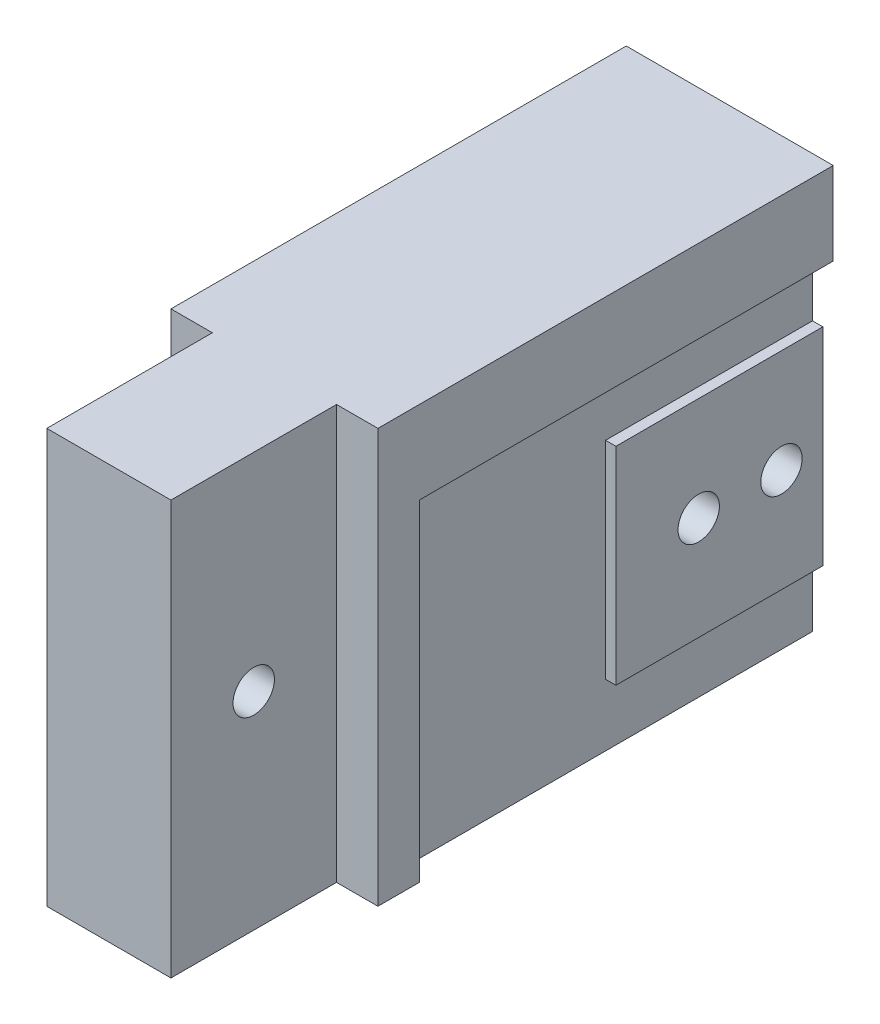
ISO-10303-21;
HEADER;
FILE_DESCRIPTION(('STEP AP214'),'2;1');
FILE_NAME('part.step','',(''),(''),'','','');
FILE_SCHEMA(('AUTOMOTIVE_DESIGN { 1 0 10303 214 1 1 1 1 }'));
ENDSEC;
DATA;
#1=APPLICATION_CONTEXT('core data for automotive mechanical design processes');
#2=APPLICATION_PROTOCOL_DEFINITION('international standard','automotive_design',2000,#1);
#3=PRODUCT_CONTEXT('',#1,'mechanical');
#4=PRODUCT('Part','Part','',(#3));
#5=PRODUCT_RELATED_PRODUCT_CATEGORY('part','',(#4));
#6=PRODUCT_DEFINITION_FORMATION('','',#4);
#7=PRODUCT_DEFINITION_CONTEXT('part definition',#1,'design');
#8=PRODUCT_DEFINITION('design','',#6,#7);
#9=PRODUCT_DEFINITION_SHAPE('','',#8);
#10=(LENGTH_UNIT() NAMED_UNIT(*) SI_UNIT(.MILLI.,.METRE.));
#11=(NAMED_UNIT(*) PLANE_ANGLE_UNIT() SI_UNIT($,.RADIAN.));
#12=(NAMED_UNIT(*) SI_UNIT($,.STERADIAN.) SOLID_ANGLE_UNIT());
#13=UNCERTAINTY_MEASURE_WITH_UNIT(LENGTH_MEASURE(1.E-05),#10,'distance_accuracy_value','');
#14=(GEOMETRIC_REPRESENTATION_CONTEXT(3) GLOBAL_UNCERTAINTY_ASSIGNED_CONTEXT((#13)) GLOBAL_UNIT_ASSIGNED_CONTEXT((#10,
#11,#12)) REPRESENTATION_CONTEXT('',''));
#15=CARTESIAN_POINT('',(0.,0.,0.));
#16=DIRECTION('',(0.,0.,1.));
#17=DIRECTION('',(1.,0.,0.));
#18=AXIS2_PLACEMENT_3D('',#15,#16,#17);
#19=CARTESIAN_POINT('',(0.,0.,0.));
#20=DIRECTION('',(1.,0.,0.));
#21=DIRECTION('',(0.,0.,-1.));
#22=AXIS2_PLACEMENT_3D('',#19,#20,#21);
#23=PLANE('',#22);
#24=DIRECTION('',(0.,-1.,0.));
#25=VECTOR('',#24,1.);
#26=CARTESIAN_POINT('',(0.,40.5369718309859,66.9542253521127));
#27=LINE('',#26,#25);
#28=CARTESIAN_POINT('',(0.,40.5369718309859,66.9542253521127));
#29=VERTEX_POINT('',#28);
#30=CARTESIAN_POINT('',(0.,-59.4630281690141,66.9542253521127));
#31=VERTEX_POINT('',#30);
#32=EDGE_CURVE('E146',#29,#31,#27,.T.);
#33=ORIENTED_EDGE('',*,*,#32,.F.);
#34=DIRECTION('',(0.,0.,1.));
#35=VECTOR('',#34,1.);
#36=CARTESIAN_POINT('',(0.,40.5369718309859,106.954225352113));
#37=LINE('',#36,#35);
#38=CARTESIAN_POINT('',(0.,40.5369718309859,-43.0457746478873));
#39=VERTEX_POINT('',#38);
#40=EDGE_CURVE('E174',#39,#29,#37,.T.);
#41=ORIENTED_EDGE('',*,*,#40,.F.);
#42=DIRECTION('',(0.,1.,0.));
#43=VECTOR('',#42,1.);
#44=CARTESIAN_POINT('',(0.,40.5369718309859,-43.0457746478873));
#45=LINE('',#44,#43);
#46=CARTESIAN_POINT('',(0.,-59.4630281690141,-43.0457746478873));
#47=VERTEX_POINT('',#46);
#48=EDGE_CURVE('E168',#47,#39,#45,.T.);
#49=ORIENTED_EDGE('',*,*,#48,.F.);
#50=DIRECTION('',(0.,0.,-1.));
#51=VECTOR('',#50,1.);
#52=CARTESIAN_POINT('',(0.,-59.4630281690141,106.954225352113));
#53=LINE('',#52,#51);
#54=EDGE_CURVE('E161',#31,#47,#53,.T.);
#55=ORIENTED_EDGE('',*,*,#54,.F.);
#56=EDGE_LOOP('',(#33,#41,#49,#55));
#57=FACE_BOUND('',#56,.T.);
#58=ADVANCED_FACE('F38',(#57),#23,.F.);
#59=CARTESIAN_POINT('',(45.,0.,0.));
#60=DIRECTION('',(1.,0.,0.));
#61=DIRECTION('',(0.,0.,-1.));
#62=AXIS2_PLACEMENT_3D('',#59,#60,#61);
#63=PLANE('',#62);
#64=DIRECTION('',(0.,-1.,0.));
#65=VECTOR('',#64,1.);
#66=CARTESIAN_POINT('',(45.,5.53697183098588,6.95422535211272));
#67=LINE('',#66,#65);
#68=CARTESIAN_POINT('',(45.,5.53697183098588,6.95422535211272));
#69=VERTEX_POINT('',#68);
#70=CARTESIAN_POINT('',(45.,-44.4630281690141,6.95422535211272));
#71=VERTEX_POINT('',#70);
#72=EDGE_CURVE('E304',#69,#71,#67,.T.);
#73=ORIENTED_EDGE('',*,*,#72,.F.);
#74=DIRECTION('',(0.,0.,1.));
#75=VECTOR('',#74,1.);
#76=CARTESIAN_POINT('',(45.,5.53697183098589,-43.0457746478873));
#77=LINE('',#76,#75);
#78=CARTESIAN_POINT('',(45.,5.53697183098589,-43.0457746478873));
#79=VERTEX_POINT('',#78);
#80=EDGE_CURVE('E273',#79,#69,#77,.T.);
#81=ORIENTED_EDGE('',*,*,#80,.F.);
#82=DIRECTION('',(0.,1.,0.));
#83=VECTOR('',#82,1.);
#84=CARTESIAN_POINT('',(45.,-59.4630281690141,-43.0457746478873));
#85=LINE('',#84,#83);
#86=CARTESIAN_POINT('',(45.,20.5369718309859,-43.0457746478873));
#87=VERTEX_POINT('',#86);
#88=EDGE_CURVE('E226',#79,#87,#85,.T.);
#89=ORIENTED_EDGE('',*,*,#88,.T.);
#90=DIRECTION('',(0.,0.,1.));
#91=VECTOR('',#90,1.);
#92=CARTESIAN_POINT('',(45.,20.5369718309859,-43.0457746478873));
#93=LINE('',#92,#91);
#94=CARTESIAN_POINT('',(45.,20.5369718309859,56.9542253521127));
#95=VERTEX_POINT('',#94);
#96=EDGE_CURVE('E214',#87,#95,#93,.T.);
#97=ORIENTED_EDGE('',*,*,#96,.T.);
#98=DIRECTION('',(0.,-1.,0.));
#99=VECTOR('',#98,1.);
#100=CARTESIAN_POINT('',(45.,-59.4630281690141,56.9542253521127));
#101=LINE('',#100,#99);
#102=CARTESIAN_POINT('',(45.,-59.4630281690141,56.9542253521127));
#103=VERTEX_POINT('',#102);
#104=EDGE_CURVE('E209',#95,#103,#101,.T.);
#105=ORIENTED_EDGE('',*,*,#104,.T.);
#106=DIRECTION('',(0.,0.,-1.));
#107=VECTOR('',#106,1.);
#108=CARTESIAN_POINT('',(45.,-59.4630281690141,-43.0457746478873));
#109=LINE('',#108,#107);
#110=CARTESIAN_POINT('',(45.,-59.4630281690141,-43.0457746478873));
#111=VERTEX_POINT('',#110);
#112=EDGE_CURVE('E203',#103,#111,#109,.T.);
#113=ORIENTED_EDGE('',*,*,#112,.T.);
#114=CARTESIAN_POINT('',(45.,-44.4630281690141,-43.0457746478873));
#115=VERTEX_POINT('',#114);
#116=EDGE_CURVE('E201',#111,#115,#85,.T.);
#117=ORIENTED_EDGE('',*,*,#116,.T.);
#118=DIRECTION('',(0.,0.,-1.));
#119=VECTOR('',#118,1.);
#120=CARTESIAN_POINT('',(45.,-44.4630281690141,-43.0457746478873));
#121=LINE('',#120,#119);
#122=EDGE_CURVE('E292',#71,#115,#121,.T.);
#123=ORIENTED_EDGE('',*,*,#122,.F.);
#124=EDGE_LOOP('',(#73,#81,#89,#97,#105,#113,#117,#123));
#125=FACE_BOUND('',#124,.T.);
#126=ADVANCED_FACE('F326',(#125),#63,.T.);
#127=CARTESIAN_POINT('',(50.,40.5369718309859,106.954225352113));
#128=DIRECTION('',(0.,0.,-1.));
#129=DIRECTION('',(-1.,0.,0.));
#130=AXIS2_PLACEMENT_3D('',#127,#128,#129);
#131=PLANE('',#130);
#132=DIRECTION('',(-1.,0.,0.));
#133=VECTOR('',#132,1.);
#134=CARTESIAN_POINT('',(50.,40.5369718309859,106.954225352113));
#135=LINE('',#134,#133);
#136=CARTESIAN_POINT('',(40.,40.5369718309859,106.954225352113));
#137=VERTEX_POINT('',#136);
#138=CARTESIAN_POINT('',(10.,40.5369718309859,106.954225352113));
#139=VERTEX_POINT('',#138);
#140=EDGE_CURVE('E186',#137,#139,#135,.T.);
#141=ORIENTED_EDGE('',*,*,#140,.T.);
#142=DIRECTION('',(0.,1.,0.));
#143=VECTOR('',#142,1.);
#144=CARTESIAN_POINT('',(10.,40.5369718309859,106.954225352113));
#145=LINE('',#144,#143);
#146=CARTESIAN_POINT('',(10.,-59.4630281690141,106.954225352113));
#147=VERTEX_POINT('',#146);
#148=EDGE_CURVE('E156',#147,#139,#145,.T.);
#149=ORIENTED_EDGE('',*,*,#148,.F.);
#150=DIRECTION('',(-1.,0.,0.));
#151=VECTOR('',#150,1.);
#152=CARTESIAN_POINT('',(50.,-59.4630281690141,106.954225352113));
#153=LINE('',#152,#151);
#154=CARTESIAN_POINT('',(40.,-59.4630281690141,106.954225352113));
#155=VERTEX_POINT('',#154);
#156=EDGE_CURVE('E11',#155,#147,#153,.T.);
#157=ORIENTED_EDGE('',*,*,#156,.F.);
#158=DIRECTION('',(0.,-1.,0.));
#159=VECTOR('',#158,1.);
#160=CARTESIAN_POINT('',(40.,40.5369718309859,106.954225352113));
#161=LINE('',#160,#159);
#162=EDGE_CURVE('E254',#137,#155,#161,.T.);
#163=ORIENTED_EDGE('',*,*,#162,.F.);
#164=EDGE_LOOP('',(#141,#149,#157,#163));
#165=FACE_BOUND('',#164,.T.);
#166=ADVANCED_FACE('F40',(#165),#131,.F.);
#167=CARTESIAN_POINT('',(50.,-59.4630281690141,106.954225352113));
#168=DIRECTION('',(0.,1.,0.));
#169=DIRECTION('',(0.,0.,1.));
#170=AXIS2_PLACEMENT_3D('',#167,#168,#169);
#171=PLANE('',#170);
#172=ORIENTED_EDGE('',*,*,#156,.T.);
#173=DIRECTION('',(0.,0.,1.));
#174=VECTOR('',#173,1.);
#175=CARTESIAN_POINT('',(10.,-59.4630281690141,66.9542253521127));
#176=LINE('',#175,#174);
#177=CARTESIAN_POINT('',(10.,-59.4630281690141,66.9542253521127));
#178=VERTEX_POINT('',#177);
#179=EDGE_CURVE('E163',#178,#147,#176,.T.);
#180=ORIENTED_EDGE('',*,*,#179,.F.);
#181=DIRECTION('',(1.,0.,0.));
#182=VECTOR('',#181,1.);
#183=CARTESIAN_POINT('',(0.,-59.4630281690141,66.9542253521127));
#184=LINE('',#183,#182);
#185=EDGE_CURVE('E149',#31,#178,#184,.T.);
#186=ORIENTED_EDGE('',*,*,#185,.F.);
#187=ORIENTED_EDGE('',*,*,#54,.T.);
#188=DIRECTION('',(-1.,0.,0.));
#189=VECTOR('',#188,1.);
#190=CARTESIAN_POINT('',(50.,-59.4630281690141,-43.0457746478873));
#191=LINE('',#190,#189);
#192=EDGE_CURVE('E47',#111,#47,#191,.T.);
#193=ORIENTED_EDGE('',*,*,#192,.F.);
#194=ORIENTED_EDGE('',*,*,#112,.F.);
#195=DIRECTION('',(1.,0.,0.));
#196=VECTOR('',#195,1.);
#197=CARTESIAN_POINT('',(45.,-59.4630281690141,56.9542253521127));
#198=LINE('',#197,#196);
#199=CARTESIAN_POINT('',(50.,-59.4630281690141,56.9542253521127));
#200=VERTEX_POINT('',#199);
#201=EDGE_CURVE('E170',#103,#200,#198,.T.);
#202=ORIENTED_EDGE('',*,*,#201,.T.);
#203=DIRECTION('',(0.,0.,-1.));
#204=VECTOR('',#203,1.);
#205=CARTESIAN_POINT('',(50.,-59.4630281690141,106.954225352113));
#206=LINE('',#205,#204);
#207=CARTESIAN_POINT('',(50.,-59.4630281690141,66.9542253521127));
#208=VERTEX_POINT('',#207);
#209=EDGE_CURVE('E185',#208,#200,#206,.T.);
#210=ORIENTED_EDGE('',*,*,#209,.F.);
#211=DIRECTION('',(1.,0.,0.));
#212=VECTOR('',#211,1.);
#213=CARTESIAN_POINT('',(50.,-59.4630281690141,66.9542253521127));
#214=LINE('',#213,#212);
#215=CARTESIAN_POINT('',(40.,-59.4630281690141,66.9542253521127));
#216=VERTEX_POINT('',#215);
#217=EDGE_CURVE('E54',#216,#208,#214,.T.);
#218=ORIENTED_EDGE('',*,*,#217,.F.);
#219=DIRECTION('',(0.,0.,1.));
#220=VECTOR('',#219,1.);
#221=CARTESIAN_POINT('',(40.,-59.4630281690141,66.9542253521127));
#222=LINE('',#221,#220);
#223=EDGE_CURVE('E263',#216,#155,#222,.T.);
#224=ORIENTED_EDGE('',*,*,#223,.T.);
#225=EDGE_LOOP('',(#172,#180,#186,#187,#193,#194,#202,#210,#218,#224));
#226=FACE_BOUND('',#225,.T.);
#227=ADVANCED_FACE('F159',(#226),#171,.F.);
#228=CARTESIAN_POINT('',(50.,40.5369718309859,-43.0457746478873));
#229=DIRECTION('',(0.,0.,1.));
#230=DIRECTION('',(0.,-1.,0.));
#231=AXIS2_PLACEMENT_3D('',#228,#229,#230);
#232=PLANE('',#231);
#233=DIRECTION('',(0.,1.,0.));
#234=VECTOR('',#233,1.);
#235=CARTESIAN_POINT('',(50.,40.5369718309859,-43.0457746478873));
#236=LINE('',#235,#234);
#237=CARTESIAN_POINT('',(50.,20.5369718309859,-43.0457746478873));
#238=VERTEX_POINT('',#237);
#239=CARTESIAN_POINT('',(50.,40.5369718309859,-43.0457746478873));
#240=VERTEX_POINT('',#239);
#241=EDGE_CURVE('E231',#238,#240,#236,.T.);
#242=ORIENTED_EDGE('',*,*,#241,.F.);
#243=DIRECTION('',(1.,0.,0.));
#244=VECTOR('',#243,1.);
#245=CARTESIAN_POINT('',(45.,20.5369718309859,-43.0457746478873));
#246=LINE('',#245,#244);
#247=EDGE_CURVE('E208',#87,#238,#246,.T.);
#248=ORIENTED_EDGE('',*,*,#247,.F.);
#249=ORIENTED_EDGE('',*,*,#88,.F.);
#250=DIRECTION('',(-1.,0.,0.));
#251=VECTOR('',#250,1.);
#252=CARTESIAN_POINT('',(47.5,5.53697183098589,-43.0457746478873));
#253=LINE('',#252,#251);
#254=CARTESIAN_POINT('',(47.5,5.53697183098589,-43.0457746478873));
#255=VERTEX_POINT('',#254);
#256=EDGE_CURVE('E223',#255,#79,#253,.T.);
#257=ORIENTED_EDGE('',*,*,#256,.F.);
#258=DIRECTION('',(0.,1.,0.));
#259=VECTOR('',#258,1.);
#260=CARTESIAN_POINT('',(47.5,5.53697183098589,-43.0457746478873));
#261=LINE('',#260,#259);
#262=CARTESIAN_POINT('',(47.5,-44.4630281690141,-43.0457746478873));
#263=VERTEX_POINT('',#262);
#264=EDGE_CURVE('E287',#263,#255,#261,.T.);
#265=ORIENTED_EDGE('',*,*,#264,.F.);
#266=DIRECTION('',(-1.,0.,0.));
#267=VECTOR('',#266,1.);
#268=CARTESIAN_POINT('',(47.5,-44.4630281690141,-43.0457746478873));
#269=LINE('',#268,#267);
#270=EDGE_CURVE('E301',#263,#115,#269,.T.);
#271=ORIENTED_EDGE('',*,*,#270,.T.);
#272=ORIENTED_EDGE('',*,*,#116,.F.);
#273=ORIENTED_EDGE('',*,*,#192,.T.);
#274=ORIENTED_EDGE('',*,*,#48,.T.);
#275=DIRECTION('',(-1.,0.,0.));
#276=VECTOR('',#275,1.);
#277=CARTESIAN_POINT('',(50.,40.5369718309859,-43.0457746478873));
#278=LINE('',#277,#276);
#279=EDGE_CURVE('E190',#240,#39,#278,.T.);
#280=ORIENTED_EDGE('',*,*,#279,.F.);
#281=EDGE_LOOP('',(#242,#248,#249,#257,#265,#271,#272,#273,#274,#280));
#282=FACE_BOUND('',#281,.T.);
#283=ADVANCED_FACE('F197',(#282),#232,.F.);
#284=CARTESIAN_POINT('',(50.,40.5369718309859,106.954225352113));
#285=DIRECTION('',(0.,-1.,0.));
#286=DIRECTION('',(0.,0.,-1.));
#287=AXIS2_PLACEMENT_3D('',#284,#285,#286);
#288=PLANE('',#287);
#289=DIRECTION('',(-1.,0.,0.));
#290=VECTOR('',#289,1.);
#291=CARTESIAN_POINT('',(0.,40.5369718309859,66.9542253521127));
#292=LINE('',#291,#290);
#293=CARTESIAN_POINT('',(10.,40.5369718309859,66.9542253521127));
#294=VERTEX_POINT('',#293);
#295=EDGE_CURVE('E62',#294,#29,#292,.T.);
#296=ORIENTED_EDGE('',*,*,#295,.F.);
#297=DIRECTION('',(0.,0.,1.));
#298=VECTOR('',#297,1.);
#299=CARTESIAN_POINT('',(10.,40.5369718309859,66.9542253521127));
#300=LINE('',#299,#298);
#301=EDGE_CURVE('E286',#294,#139,#300,.T.);
#302=ORIENTED_EDGE('',*,*,#301,.T.);
#303=ORIENTED_EDGE('',*,*,#140,.F.);
#304=DIRECTION('',(0.,0.,1.));
#305=VECTOR('',#304,1.);
#306=CARTESIAN_POINT('',(40.,40.5369718309859,66.9542253521127));
#307=LINE('',#306,#305);
#308=CARTESIAN_POINT('',(40.,40.5369718309859,66.9542253521127));
#309=VERTEX_POINT('',#308);
#310=EDGE_CURVE('E247',#309,#137,#307,.T.);
#311=ORIENTED_EDGE('',*,*,#310,.F.);
#312=DIRECTION('',(-1.,0.,0.));
#313=VECTOR('',#312,1.);
#314=CARTESIAN_POINT('',(50.,40.5369718309859,66.9542253521127));
#315=LINE('',#314,#313);
#316=CARTESIAN_POINT('',(50.,40.5369718309859,66.9542253521127));
#317=VERTEX_POINT('',#316);
#318=EDGE_CURVE('E245',#317,#309,#315,.T.);
#319=ORIENTED_EDGE('',*,*,#318,.F.);
#320=DIRECTION('',(0.,0.,1.));
#321=VECTOR('',#320,1.);
#322=CARTESIAN_POINT('',(50.,40.5369718309859,106.954225352113));
#323=LINE('',#322,#321);
#324=EDGE_CURVE('E180',#240,#317,#323,.T.);
#325=ORIENTED_EDGE('',*,*,#324,.F.);
#326=ORIENTED_EDGE('',*,*,#279,.T.);
#327=ORIENTED_EDGE('',*,*,#40,.T.);
#328=EDGE_LOOP('',(#296,#302,#303,#311,#319,#325,#326,#327));
#329=FACE_BOUND('',#328,.T.);
#330=ADVANCED_FACE('F242',(#329),#288,.F.);
#331=CARTESIAN_POINT('',(50.,0.,0.));
#332=DIRECTION('',(1.,0.,0.));
#333=DIRECTION('',(0.,0.,-1.));
#334=AXIS2_PLACEMENT_3D('',#331,#332,#333);
#335=PLANE('',#334);
#336=DIRECTION('',(0.,1.,0.));
#337=VECTOR('',#336,1.);
#338=CARTESIAN_POINT('',(50.,40.5369718309859,66.9542253521127));
#339=LINE('',#338,#337);
#340=EDGE_CURVE('E239',#208,#317,#339,.T.);
#341=ORIENTED_EDGE('',*,*,#340,.F.);
#342=ORIENTED_EDGE('',*,*,#209,.T.);
#343=DIRECTION('',(0.,-1.,0.));
#344=VECTOR('',#343,1.);
#345=CARTESIAN_POINT('',(50.,-59.4630281690141,56.9542253521127));
#346=LINE('',#345,#344);
#347=CARTESIAN_POINT('',(50.,20.5369718309859,56.9542253521127));
#348=VERTEX_POINT('',#347);
#349=EDGE_CURVE('E222',#348,#200,#346,.T.);
#350=ORIENTED_EDGE('',*,*,#349,.F.);
#351=DIRECTION('',(0.,0.,1.));
#352=VECTOR('',#351,1.);
#353=CARTESIAN_POINT('',(50.,20.5369718309859,-43.0457746478873));
#354=LINE('',#353,#352);
#355=EDGE_CURVE('E218',#238,#348,#354,.T.);
#356=ORIENTED_EDGE('',*,*,#355,.F.);
#357=ORIENTED_EDGE('',*,*,#241,.T.);
#358=ORIENTED_EDGE('',*,*,#324,.T.);
#359=EDGE_LOOP('',(#341,#342,#350,#356,#357,#358));
#360=FACE_BOUND('',#359,.T.);
#361=ADVANCED_FACE('F238',(#360),#335,.T.);
#362=CARTESIAN_POINT('',(45.,-59.4630281690141,56.9542253521127));
#363=DIRECTION('',(0.,0.,1.));
#364=DIRECTION('',(1.,0.,0.));
#365=AXIS2_PLACEMENT_3D('',#362,#363,#364);
#366=PLANE('',#365);
#367=ORIENTED_EDGE('',*,*,#349,.T.);
#368=ORIENTED_EDGE('',*,*,#201,.F.);
#369=ORIENTED_EDGE('',*,*,#104,.F.);
#370=DIRECTION('',(1.,0.,0.));
#371=VECTOR('',#370,1.);
#372=CARTESIAN_POINT('',(45.,20.5369718309859,56.9542253521127));
#373=LINE('',#372,#371);
#374=EDGE_CURVE('E177',#95,#348,#373,.T.);
#375=ORIENTED_EDGE('',*,*,#374,.T.);
#376=EDGE_LOOP('',(#367,#368,#369,#375));
#377=FACE_BOUND('',#376,.T.);
#378=ADVANCED_FACE('F429',(#377),#366,.F.);
#379=CARTESIAN_POINT('',(45.,20.5369718309859,-43.0457746478873));
#380=DIRECTION('',(0.,1.,0.));
#381=DIRECTION('',(0.,0.,1.));
#382=AXIS2_PLACEMENT_3D('',#379,#380,#381);
#383=PLANE('',#382);
#384=ORIENTED_EDGE('',*,*,#355,.T.);
#385=ORIENTED_EDGE('',*,*,#374,.F.);
#386=ORIENTED_EDGE('',*,*,#96,.F.);
#387=ORIENTED_EDGE('',*,*,#247,.T.);
#388=EDGE_LOOP('',(#384,#385,#386,#387));
#389=FACE_BOUND('',#388,.T.);
#390=ADVANCED_FACE('F332',(#389),#383,.F.);
#391=CARTESIAN_POINT('',(47.5,5.53697183098589,-43.0457746478873));
#392=DIRECTION('',(0.,-1.,0.));
#393=DIRECTION('',(0.,0.,-1.));
#394=AXIS2_PLACEMENT_3D('',#391,#392,#393);
#395=PLANE('',#394);
#396=ORIENTED_EDGE('',*,*,#80,.T.);
#397=DIRECTION('',(-1.,0.,0.));
#398=VECTOR('',#397,1.);
#399=CARTESIAN_POINT('',(47.5,5.53697183098588,6.95422535211272));
#400=LINE('',#399,#398);
#401=CARTESIAN_POINT('',(47.5,5.53697183098588,6.95422535211272));
#402=VERTEX_POINT('',#401);
#403=EDGE_CURVE('E315',#402,#69,#400,.T.);
#404=ORIENTED_EDGE('',*,*,#403,.F.);
#405=DIRECTION('',(0.,0.,1.));
#406=VECTOR('',#405,1.);
#407=CARTESIAN_POINT('',(47.5,5.53697183098589,-43.0457746478873));
#408=LINE('',#407,#406);
#409=EDGE_CURVE('E291',#255,#402,#408,.T.);
#410=ORIENTED_EDGE('',*,*,#409,.F.);
#411=ORIENTED_EDGE('',*,*,#256,.T.);
#412=EDGE_LOOP('',(#396,#404,#410,#411));
#413=FACE_BOUND('',#412,.T.);
#414=ADVANCED_FACE('F444',(#413),#395,.F.);
#415=CARTESIAN_POINT('',(47.5,5.53697183098588,6.95422535211272));
#416=DIRECTION('',(0.,0.,-1.));
#417=DIRECTION('',(0.,1.,0.));
#418=AXIS2_PLACEMENT_3D('',#415,#416,#417);
#419=PLANE('',#418);
#420=ORIENTED_EDGE('',*,*,#72,.T.);
#421=DIRECTION('',(-1.,0.,0.));
#422=VECTOR('',#421,1.);
#423=CARTESIAN_POINT('',(47.5,-44.4630281690141,6.95422535211272));
#424=LINE('',#423,#422);
#425=CARTESIAN_POINT('',(47.5,-44.4630281690141,6.95422535211272));
#426=VERTEX_POINT('',#425);
#427=EDGE_CURVE('E312',#426,#71,#424,.T.);
#428=ORIENTED_EDGE('',*,*,#427,.F.);
#429=DIRECTION('',(0.,-1.,0.));
#430=VECTOR('',#429,1.);
#431=CARTESIAN_POINT('',(47.5,5.53697183098588,6.95422535211272));
#432=LINE('',#431,#430);
#433=EDGE_CURVE('E295',#402,#426,#432,.T.);
#434=ORIENTED_EDGE('',*,*,#433,.F.);
#435=ORIENTED_EDGE('',*,*,#403,.T.);
#436=EDGE_LOOP('',(#420,#428,#434,#435));
#437=FACE_BOUND('',#436,.T.);
#438=ADVANCED_FACE('F449',(#437),#419,.F.);
#439=CARTESIAN_POINT('',(47.5,-44.4630281690141,-43.0457746478873));
#440=DIRECTION('',(0.,1.,0.));
#441=DIRECTION('',(0.,0.,1.));
#442=AXIS2_PLACEMENT_3D('',#439,#440,#441);
#443=PLANE('',#442);
#444=ORIENTED_EDGE('',*,*,#122,.T.);
#445=ORIENTED_EDGE('',*,*,#270,.F.);
#446=DIRECTION('',(0.,0.,-1.));
#447=VECTOR('',#446,1.);
#448=CARTESIAN_POINT('',(47.5,-44.4630281690141,-43.0457746478873));
#449=LINE('',#448,#447);
#450=EDGE_CURVE('E298',#426,#263,#449,.T.);
#451=ORIENTED_EDGE('',*,*,#450,.F.);
#452=ORIENTED_EDGE('',*,*,#427,.T.);
#453=EDGE_LOOP('',(#444,#445,#451,#452));
#454=FACE_BOUND('',#453,.T.);
#455=ADVANCED_FACE('F457',(#454),#443,.F.);
#456=CARTESIAN_POINT('',(47.5,0.,0.));
#457=DIRECTION('',(-1.,0.,0.));
#458=DIRECTION('',(0.,0.,1.));
#459=AXIS2_PLACEMENT_3D('',#456,#457,#458);
#460=PLANE('',#459);
#461=CARTESIAN_POINT('',(47.5,-19.4630281690141,-33.0457746478873));
#462=DIRECTION('',(1.,0.,0.));
#463=DIRECTION('',(0.,0.,-1.));
#464=AXIS2_PLACEMENT_3D('',#461,#462,#463);
#465=CIRCLE('',#464,5.);
#466=CARTESIAN_POINT('',(47.5,-19.4630281690141,-38.0457746478873));
#467=VERTEX_POINT('',#466);
#468=EDGE_CURVE('E274',#467,#467,#465,.T.);
#469=ORIENTED_EDGE('',*,*,#468,.F.);
#470=EDGE_LOOP('',(#469));
#471=FACE_BOUND('',#470,.T.);
#472=CARTESIAN_POINT('',(47.5,-19.4630281690141,-13.0457746478873));
#473=DIRECTION('',(1.,0.,0.));
#474=DIRECTION('',(0.,0.,-1.));
#475=AXIS2_PLACEMENT_3D('',#472,#473,#474);
#476=CIRCLE('',#475,5.);
#477=CARTESIAN_POINT('',(47.5,-19.4630281690141,-18.0457746478873));
#478=VERTEX_POINT('',#477);
#479=EDGE_CURVE('E282',#478,#478,#476,.T.);
#480=ORIENTED_EDGE('',*,*,#479,.F.);
#481=EDGE_LOOP('',(#480));
#482=FACE_BOUND('',#481,.T.);
#483=ORIENTED_EDGE('',*,*,#264,.T.);
#484=ORIENTED_EDGE('',*,*,#409,.T.);
#485=ORIENTED_EDGE('',*,*,#433,.T.);
#486=ORIENTED_EDGE('',*,*,#450,.T.);
#487=EDGE_LOOP('',(#483,#484,#485,#486));
#488=FACE_BOUND('',#487,.T.);
#489=ADVANCED_FACE('F465',(#471,#482,#488),#460,.F.);
#490=CARTESIAN_POINT('',(37.5,-19.4630281690141,-13.0457746478873));
#491=DIRECTION('',(1.,0.,0.));
#492=DIRECTION('',(0.,0.,-1.));
#493=AXIS2_PLACEMENT_3D('',#490,#491,#492);
#494=CYLINDRICAL_SURFACE('',#493,5.);
#495=CARTESIAN_POINT('',(37.5,-19.4630281690141,-13.0457746478873));
#496=DIRECTION('',(1.,0.,0.));
#497=DIRECTION('',(0.,0.,-1.));
#498=AXIS2_PLACEMENT_3D('',#495,#496,#497);
#499=CIRCLE('',#498,5.);
#500=CARTESIAN_POINT('',(37.5,-19.4630281690141,-18.0457746478873));
#501=VERTEX_POINT('',#500);
#502=EDGE_CURVE('E278',#501,#501,#499,.T.);
#503=ORIENTED_EDGE('',*,*,#502,.F.);
#504=EDGE_LOOP('',(#503));
#505=FACE_BOUND('',#504,.T.);
#506=ORIENTED_EDGE('',*,*,#479,.T.);
#507=EDGE_LOOP('',(#506));
#508=FACE_BOUND('',#507,.T.);
#509=ADVANCED_FACE('F473',(#505,#508),#494,.F.);
#510=CARTESIAN_POINT('',(37.5,-19.4630281690141,-13.0457746478873));
#511=DIRECTION('',(1.,0.,0.));
#512=DIRECTION('',(0.,0.,-1.));
#513=AXIS2_PLACEMENT_3D('',#510,#511,#512);
#514=PLANE('',#513);
#515=ORIENTED_EDGE('',*,*,#502,.T.);
#516=EDGE_LOOP('',(#515));
#517=FACE_BOUND('',#516,.T.);
#518=ADVANCED_FACE('F481',(#517),#514,.T.);
#519=CARTESIAN_POINT('',(37.5,-19.4630281690141,-33.0457746478873));
#520=DIRECTION('',(1.,0.,0.));
#521=DIRECTION('',(0.,0.,-1.));
#522=AXIS2_PLACEMENT_3D('',#519,#520,#521);
#523=CYLINDRICAL_SURFACE('',#522,5.);
#524=CARTESIAN_POINT('',(37.5,-19.4630281690141,-33.0457746478873));
#525=DIRECTION('',(1.,0.,0.));
#526=DIRECTION('',(0.,0.,-1.));
#527=AXIS2_PLACEMENT_3D('',#524,#525,#526);
#528=CIRCLE('',#527,5.);
#529=CARTESIAN_POINT('',(37.5,-19.4630281690141,-38.0457746478873));
#530=VERTEX_POINT('',#529);
#531=EDGE_CURVE('E269',#530,#530,#528,.T.);
#532=ORIENTED_EDGE('',*,*,#531,.F.);
#533=EDGE_LOOP('',(#532));
#534=FACE_BOUND('',#533,.T.);
#535=ORIENTED_EDGE('',*,*,#468,.T.);
#536=EDGE_LOOP('',(#535));
#537=FACE_BOUND('',#536,.T.);
#538=ADVANCED_FACE('F379',(#534,#537),#523,.F.);
#539=CARTESIAN_POINT('',(37.5,-19.4630281690141,-33.0457746478873));
#540=DIRECTION('',(1.,0.,0.));
#541=DIRECTION('',(0.,0.,-1.));
#542=AXIS2_PLACEMENT_3D('',#539,#540,#541);
#543=PLANE('',#542);
#544=ORIENTED_EDGE('',*,*,#531,.T.);
#545=EDGE_LOOP('',(#544));
#546=FACE_BOUND('',#545,.T.);
#547=ADVANCED_FACE('F370',(#546),#543,.T.);
#548=CARTESIAN_POINT('',(10.,40.5369718309859,66.9542253521127));
#549=DIRECTION('',(1.,0.,0.));
#550=DIRECTION('',(0.,1.,0.));
#551=AXIS2_PLACEMENT_3D('',#548,#549,#550);
#552=PLANE('',#551);
#553=CARTESIAN_POINT('',(10.,-9.46302816901409,86.9542253521127));
#554=DIRECTION('',(1.,0.,0.));
#555=DIRECTION('',(0.,1.,0.));
#556=AXIS2_PLACEMENT_3D('',#553,#554,#555);
#557=CIRCLE('',#556,5.);
#558=CARTESIAN_POINT('',(10.,-4.46302816901409,86.9542253521127));
#559=VERTEX_POINT('',#558);
#560=EDGE_CURVE('E262',#559,#559,#557,.T.);
#561=ORIENTED_EDGE('',*,*,#560,.T.);
#562=EDGE_LOOP('',(#561));
#563=FACE_BOUND('',#562,.T.);
#564=ORIENTED_EDGE('',*,*,#148,.T.);
#565=ORIENTED_EDGE('',*,*,#301,.F.);
#566=DIRECTION('',(0.,1.,0.));
#567=VECTOR('',#566,1.);
#568=CARTESIAN_POINT('',(10.,40.5369718309859,66.9542253521127));
#569=LINE('',#568,#567);
#570=EDGE_CURVE('E165',#178,#294,#569,.T.);
#571=ORIENTED_EDGE('',*,*,#570,.F.);
#572=ORIENTED_EDGE('',*,*,#179,.T.);
#573=EDGE_LOOP('',(#564,#565,#571,#572));
#574=FACE_BOUND('',#573,.T.);
#575=ADVANCED_FACE('F368',(#563,#574),#552,.F.);
#576=CARTESIAN_POINT('',(0.,0.,66.9542253521127));
#577=DIRECTION('',(0.,0.,1.));
#578=DIRECTION('',(1.,0.,0.));
#579=AXIS2_PLACEMENT_3D('',#576,#577,#578);
#580=PLANE('',#579);
#581=ORIENTED_EDGE('',*,*,#32,.T.);
#582=ORIENTED_EDGE('',*,*,#185,.T.);
#583=ORIENTED_EDGE('',*,*,#570,.T.);
#584=ORIENTED_EDGE('',*,*,#295,.T.);
#585=EDGE_LOOP('',(#581,#582,#583,#584));
#586=FACE_BOUND('',#585,.T.);
#587=ADVANCED_FACE('F148',(#586),#580,.T.);
#588=CARTESIAN_POINT('',(40.,40.5369718309859,66.9542253521127));
#589=DIRECTION('',(-1.,0.,0.));
#590=DIRECTION('',(0.,-1.,0.));
#591=AXIS2_PLACEMENT_3D('',#588,#589,#590);
#592=PLANE('',#591);
#593=CARTESIAN_POINT('',(40.,-9.4630281690141,86.9542253521127));
#594=DIRECTION('',(1.,0.,0.));
#595=DIRECTION('',(0.,1.,0.));
#596=AXIS2_PLACEMENT_3D('',#593,#594,#595);
#597=CIRCLE('',#596,5.);
#598=CARTESIAN_POINT('',(40.,-4.46302816901409,86.9542253521127));
#599=VERTEX_POINT('',#598);
#600=EDGE_CURVE('E352',#599,#599,#597,.T.);
#601=ORIENTED_EDGE('',*,*,#600,.F.);
#602=EDGE_LOOP('',(#601));
#603=FACE_BOUND('',#602,.T.);
#604=ORIENTED_EDGE('',*,*,#162,.T.);
#605=ORIENTED_EDGE('',*,*,#223,.F.);
#606=DIRECTION('',(0.,-1.,0.));
#607=VECTOR('',#606,1.);
#608=CARTESIAN_POINT('',(40.,40.5369718309859,66.9542253521127));
#609=LINE('',#608,#607);
#610=EDGE_CURVE('E249',#309,#216,#609,.T.);
#611=ORIENTED_EDGE('',*,*,#610,.F.);
#612=ORIENTED_EDGE('',*,*,#310,.T.);
#613=EDGE_LOOP('',(#604,#605,#611,#612));
#614=FACE_BOUND('',#613,.T.);
#615=ADVANCED_FACE('F360',(#603,#614),#592,.F.);
#616=CARTESIAN_POINT('',(0.,0.,66.9542253521127));
#617=DIRECTION('',(0.,0.,-1.));
#618=DIRECTION('',(-1.,0.,0.));
#619=AXIS2_PLACEMENT_3D('',#616,#617,#618);
#620=PLANE('',#619);
#621=ORIENTED_EDGE('',*,*,#340,.T.);
#622=ORIENTED_EDGE('',*,*,#318,.T.);
#623=ORIENTED_EDGE('',*,*,#610,.T.);
#624=ORIENTED_EDGE('',*,*,#217,.T.);
#625=EDGE_LOOP('',(#621,#622,#623,#624));
#626=FACE_BOUND('',#625,.T.);
#627=ADVANCED_FACE('F363',(#626),#620,.F.);
#628=CARTESIAN_POINT('',(0.,-9.46302816901409,86.9542253521127));
#629=DIRECTION('',(1.,0.,0.));
#630=DIRECTION('',(0.,1.,0.));
#631=AXIS2_PLACEMENT_3D('',#628,#629,#630);
#632=CYLINDRICAL_SURFACE('',#631,5.);
#633=ORIENTED_EDGE('',*,*,#600,.T.);
#634=EDGE_LOOP('',(#633));
#635=FACE_BOUND('',#634,.T.);
#636=ORIENTED_EDGE('',*,*,#560,.F.);
#637=EDGE_LOOP('',(#636));
#638=FACE_BOUND('',#637,.T.);
#639=ADVANCED_FACE('F357',(#635,#638),#632,.F.);
#640=CLOSED_SHELL('',(#58,#126,#166,#227,#283,#330,#361,#378,#390,#414,#438,#455,#489,#509,#518,
#538,#547,#575,#587,#615,#627,#639));
#641=MANIFOLD_SOLID_BREP('B2',#640);
#642=ADVANCED_BREP_SHAPE_REPRESENTATION('',(#18,#641),#14);
#643=SHAPE_DEFINITION_REPRESENTATION(#9,#642);
ENDSEC;
END-ISO-10303-21;
